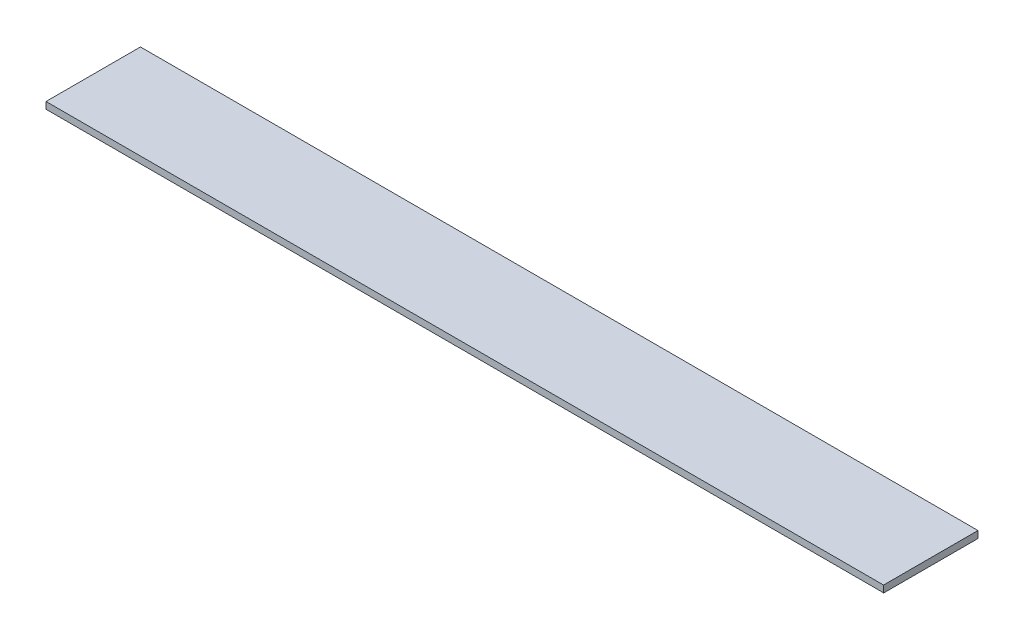
ISO-10303-21;
HEADER;
FILE_DESCRIPTION(('STEP AP214'),'2;1');
FILE_NAME('part.step','',(''),(''),'','','');
FILE_SCHEMA(('AUTOMOTIVE_DESIGN { 1 0 10303 214 1 1 1 1 }'));
ENDSEC;
DATA;
#1=APPLICATION_CONTEXT('core data for automotive mechanical design processes');
#2=APPLICATION_PROTOCOL_DEFINITION('international standard','automotive_design',2000,#1);
#3=PRODUCT_CONTEXT('',#1,'mechanical');
#4=PRODUCT('Part','Part','',(#3));
#5=PRODUCT_RELATED_PRODUCT_CATEGORY('part','',(#4));
#6=PRODUCT_DEFINITION_FORMATION('','',#4);
#7=PRODUCT_DEFINITION_CONTEXT('part definition',#1,'design');
#8=PRODUCT_DEFINITION('design','',#6,#7);
#9=PRODUCT_DEFINITION_SHAPE('','',#8);
#10=(LENGTH_UNIT() NAMED_UNIT(*) SI_UNIT(.MILLI.,.METRE.));
#11=(NAMED_UNIT(*) PLANE_ANGLE_UNIT() SI_UNIT($,.RADIAN.));
#12=(NAMED_UNIT(*) SI_UNIT($,.STERADIAN.) SOLID_ANGLE_UNIT());
#13=UNCERTAINTY_MEASURE_WITH_UNIT(LENGTH_MEASURE(1.E-05),#10,'distance_accuracy_value','');
#14=(GEOMETRIC_REPRESENTATION_CONTEXT(3) GLOBAL_UNCERTAINTY_ASSIGNED_CONTEXT((#13)) GLOBAL_UNIT_ASSIGNED_CONTEXT((#10,
#11,#12)) REPRESENTATION_CONTEXT('',''));
#15=CARTESIAN_POINT('',(0.,0.,0.));
#16=DIRECTION('',(0.,0.,1.));
#17=DIRECTION('',(1.,0.,0.));
#18=AXIS2_PLACEMENT_3D('',#15,#16,#17);
#19=CARTESIAN_POINT('',(32.000000298023,1.800000014901,36.506000238419));
#20=DIRECTION('',(0.,1.,0.));
#21=DIRECTION('',(1.,0.,0.));
#22=AXIS2_PLACEMENT_3D('',#19,#20,#21);
#23=PLANE('',#22);
#24=DIRECTION('',(1.,0.,0.));
#25=VECTOR('',#24,1.);
#26=CARTESIAN_POINT('',(32.000000298023,1.800000014901,37.906000238419));
#27=LINE('',#26,#25);
#28=CARTESIAN_POINT('',(32.000000298023,1.800000014901,37.906000238419));
#29=VERTEX_POINT('',#28);
#30=CARTESIAN_POINT('',(44.413967689517,1.800000014901,37.906000238419));
#31=VERTEX_POINT('',#30);
#32=EDGE_CURVE('E28',#29,#31,#27,.T.);
#33=ORIENTED_EDGE('',*,*,#32,.T.);
#34=DIRECTION('',(0.,0.,-1.));
#35=VECTOR('',#34,1.);
#36=CARTESIAN_POINT('',(44.413967688587,1.800000014901,36.506000238419));
#37=LINE('',#36,#35);
#38=CARTESIAN_POINT('',(44.413967688587,1.800000014901,36.506000238419));
#39=VERTEX_POINT('',#38);
#40=EDGE_CURVE('E11',#31,#39,#37,.T.);
#41=ORIENTED_EDGE('',*,*,#40,.T.);
#42=DIRECTION('',(-1.,0.,0.));
#43=VECTOR('',#42,1.);
#44=CARTESIAN_POINT('',(32.000000298023,1.800000014901,36.506000238419));
#45=LINE('',#44,#43);
#46=CARTESIAN_POINT('',(32.000000298023,1.800000014901,36.506000238419));
#47=VERTEX_POINT('',#46);
#48=EDGE_CURVE('E107',#39,#47,#45,.T.);
#49=ORIENTED_EDGE('',*,*,#48,.T.);
#50=DIRECTION('',(0.,0.,1.));
#51=VECTOR('',#50,1.);
#52=CARTESIAN_POINT('',(32.000000298023,1.800000014901,36.506000238419));
#53=LINE('',#52,#51);
#54=EDGE_CURVE('E81',#47,#29,#53,.T.);
#55=ORIENTED_EDGE('',*,*,#54,.T.);
#56=EDGE_LOOP('',(#33,#41,#49,#55));
#57=FACE_BOUND('',#56,.T.);
#58=ADVANCED_FACE('F17',(#57),#23,.T.);
#59=CARTESIAN_POINT('',(44.413967688587,0.908042225991,37.206000238419));
#60=DIRECTION('',(1.,0.,0.));
#61=DIRECTION('',(0.,0.,-1.));
#62=AXIS2_PLACEMENT_3D('',#59,#60,#61);
#63=PLANE('',#62);
#64=ORIENTED_EDGE('',*,*,#40,.F.);
#65=DIRECTION('',(0.,-1.,0.));
#66=VECTOR('',#65,1.);
#67=CARTESIAN_POINT('',(44.413967688587,0.908042225991,37.906000238419));
#68=LINE('',#67,#66);
#69=CARTESIAN_POINT('',(44.413967656108,1.696945691699,37.906000238419));
#70=VERTEX_POINT('',#69);
#71=EDGE_CURVE('E73',#31,#70,#68,.T.);
#72=ORIENTED_EDGE('',*,*,#71,.T.);
#73=DIRECTION('',(0.,0.,-1.));
#74=VECTOR('',#73,1.);
#75=CARTESIAN_POINT('',(44.413967688587,1.696945827721,37.206000238419));
#76=LINE('',#75,#74);
#77=CARTESIAN_POINT('',(44.413967655643,1.696945691815,36.506000238419));
#78=VERTEX_POINT('',#77);
#79=EDGE_CURVE('E77',#70,#78,#76,.T.);
#80=ORIENTED_EDGE('',*,*,#79,.T.);
#81=DIRECTION('',(0.,1.,0.));
#82=VECTOR('',#81,1.);
#83=CARTESIAN_POINT('',(44.413967688587,0.908042225991,36.506000238419));
#84=LINE('',#83,#82);
#85=EDGE_CURVE('E111',#78,#39,#84,.T.);
#86=ORIENTED_EDGE('',*,*,#85,.T.);
#87=EDGE_LOOP('',(#64,#72,#80,#86));
#88=FACE_BOUND('',#87,.T.);
#89=ADVANCED_FACE('F75',(#88),#63,.T.);
#90=CARTESIAN_POINT('',(32.000000298023,1.800000014901,37.906000238419));
#91=DIRECTION('',(0.,0.,1.));
#92=DIRECTION('',(1.,0.,0.));
#93=AXIS2_PLACEMENT_3D('',#90,#91,#92);
#94=PLANE('',#93);
#95=DIRECTION('',(1.,0.,0.));
#96=VECTOR('',#95,1.);
#97=CARTESIAN_POINT('',(32.000000298023,1.700000014901,37.906000238419));
#98=LINE('',#97,#96);
#99=CARTESIAN_POINT('',(32.000000298023,1.700000014901,37.906000238419));
#100=VERTEX_POINT('',#99);
#101=CARTESIAN_POINT('',(44.401700418317,1.700000037618,37.906000238419));
#102=VERTEX_POINT('',#101);
#103=EDGE_CURVE('E21',#100,#102,#98,.T.);
#104=ORIENTED_EDGE('',*,*,#103,.T.);
#105=DIRECTION('',(0.970377161667245,-0.241595041577061,0.));
#106=VECTOR('',#105,1.);
#107=CARTESIAN_POINT('',(44.401700412659,1.700000014901,37.906000238419));
#108=LINE('',#107,#106);
#109=EDGE_CURVE('E84',#102,#70,#108,.T.);
#110=ORIENTED_EDGE('',*,*,#109,.T.);
#111=ORIENTED_EDGE('',*,*,#71,.F.);
#112=ORIENTED_EDGE('',*,*,#32,.F.);
#113=DIRECTION('',(0.,-1.,0.));
#114=VECTOR('',#113,1.);
#115=CARTESIAN_POINT('',(32.000000298023,1.800000014901,37.906000238419));
#116=LINE('',#115,#114);
#117=EDGE_CURVE('E118',#29,#100,#116,.T.);
#118=ORIENTED_EDGE('',*,*,#117,.T.);
#119=EDGE_LOOP('',(#104,#110,#111,#112,#118));
#120=FACE_BOUND('',#119,.T.);
#121=ADVANCED_FACE('F85',(#120),#94,.T.);
#122=CARTESIAN_POINT('',(32.000000298023,1.750000014901,37.206000238419));
#123=DIRECTION('',(-1.,0.,0.));
#124=DIRECTION('',(0.,1.,0.));
#125=AXIS2_PLACEMENT_3D('',#122,#123,#124);
#126=PLANE('',#125);
#127=DIRECTION('',(0.,-1.,0.));
#128=VECTOR('',#127,1.);
#129=CARTESIAN_POINT('',(32.000000298023,1.750000014901,36.506000238419));
#130=LINE('',#129,#128);
#131=CARTESIAN_POINT('',(32.000000298023,1.700000014901,36.506000238419));
#132=VERTEX_POINT('',#131);
#133=EDGE_CURVE('E91',#47,#132,#130,.T.);
#134=ORIENTED_EDGE('',*,*,#133,.T.);
#135=DIRECTION('',(0.,0.,1.));
#136=VECTOR('',#135,1.);
#137=CARTESIAN_POINT('',(32.000000298023,1.700000014901,37.206000238419));
#138=LINE('',#137,#136);
#139=EDGE_CURVE('E103',#132,#100,#138,.T.);
#140=ORIENTED_EDGE('',*,*,#139,.T.);
#141=ORIENTED_EDGE('',*,*,#117,.F.);
#142=ORIENTED_EDGE('',*,*,#54,.F.);
#143=EDGE_LOOP('',(#134,#140,#141,#142));
#144=FACE_BOUND('',#143,.T.);
#145=ADVANCED_FACE('F132',(#144),#126,.T.);
#146=CARTESIAN_POINT('',(32.000000298023,1.700000014901,36.506000238419));
#147=DIRECTION('',(0.,0.,-1.));
#148=DIRECTION('',(-1.,0.,0.));
#149=AXIS2_PLACEMENT_3D('',#146,#147,#148);
#150=PLANE('',#149);
#151=ORIENTED_EDGE('',*,*,#133,.F.);
#152=ORIENTED_EDGE('',*,*,#48,.F.);
#153=ORIENTED_EDGE('',*,*,#85,.F.);
#154=DIRECTION('',(-0.970377161667245,0.241595041577061,0.));
#155=VECTOR('',#154,1.);
#156=CARTESIAN_POINT('',(44.413967690447,1.696945827721,36.506000238419));
#157=LINE('',#156,#155);
#158=CARTESIAN_POINT('',(44.401700423974,1.700000060336,36.506000238419));
#159=VERTEX_POINT('',#158);
#160=EDGE_CURVE('E93',#78,#159,#157,.T.);
#161=ORIENTED_EDGE('',*,*,#160,.T.);
#162=DIRECTION('',(-1.,0.,0.));
#163=VECTOR('',#162,1.);
#164=CARTESIAN_POINT('',(32.000000298023,1.700000014901,36.506000238419));
#165=LINE('',#164,#163);
#166=EDGE_CURVE('E106',#159,#132,#165,.T.);
#167=ORIENTED_EDGE('',*,*,#166,.T.);
#168=EDGE_LOOP('',(#151,#152,#153,#161,#167));
#169=FACE_BOUND('',#168,.T.);
#170=ADVANCED_FACE('F172',(#169),#150,.T.);
#171=CARTESIAN_POINT('',(44.401700412659,1.700000014901,37.906000238419));
#172=DIRECTION('',(-0.241595007104003,-0.97037717025001,0.));
#173=DIRECTION('',(-0.97037717025001,0.241595007104003,0.));
#174=AXIS2_PLACEMENT_3D('',#171,#172,#173);
#175=PLANE('',#174);
#176=DIRECTION('',(0.,0.,-1.));
#177=VECTOR('',#176,1.);
#178=CARTESIAN_POINT('',(44.401700412659,1.700000014901,37.206000238419));
#179=LINE('',#178,#177);
#180=EDGE_CURVE('E104',#102,#159,#179,.T.);
#181=ORIENTED_EDGE('',*,*,#180,.T.);
#182=ORIENTED_EDGE('',*,*,#160,.F.);
#183=ORIENTED_EDGE('',*,*,#79,.F.);
#184=ORIENTED_EDGE('',*,*,#109,.F.);
#185=EDGE_LOOP('',(#181,#182,#183,#184));
#186=FACE_BOUND('',#185,.T.);
#187=ADVANCED_FACE('F19',(#186),#175,.T.);
#188=CARTESIAN_POINT('',(32.000000298023,1.700000014901,37.906000238419));
#189=DIRECTION('',(0.,-1.,0.));
#190=DIRECTION('',(0.,0.,-1.));
#191=AXIS2_PLACEMENT_3D('',#188,#189,#190);
#192=PLANE('',#191);
#193=ORIENTED_EDGE('',*,*,#139,.F.);
#194=ORIENTED_EDGE('',*,*,#166,.F.);
#195=ORIENTED_EDGE('',*,*,#180,.F.);
#196=ORIENTED_EDGE('',*,*,#103,.F.);
#197=EDGE_LOOP('',(#193,#194,#195,#196));
#198=FACE_BOUND('',#197,.T.);
#199=ADVANCED_FACE('F135',(#198),#192,.T.);
#200=CLOSED_SHELL('',(#58,#89,#121,#145,#170,#187,#199));
#201=MANIFOLD_SOLID_BREP('B1',#200);
#202=ADVANCED_BREP_SHAPE_REPRESENTATION('',(#18,#201),#14);
#203=SHAPE_DEFINITION_REPRESENTATION(#9,#202);
ENDSEC;
END-ISO-10303-21;
